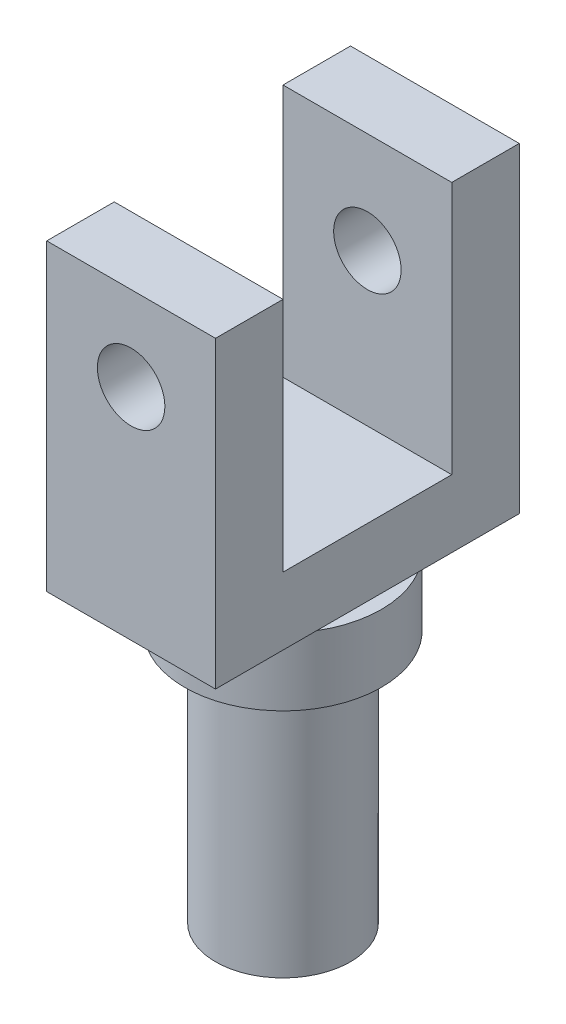
ISO-10303-21;
HEADER;
FILE_DESCRIPTION(('STEP AP214'),'2;1');
FILE_NAME('part.step','',(''),(''),'','','');
FILE_SCHEMA(('AUTOMOTIVE_DESIGN { 1 0 10303 214 1 1 1 1 }'));
ENDSEC;
DATA;
#1=APPLICATION_CONTEXT('core data for automotive mechanical design processes');
#2=APPLICATION_PROTOCOL_DEFINITION('international standard','automotive_design',2000,#1);
#3=PRODUCT_CONTEXT('',#1,'mechanical');
#4=PRODUCT('Part','Part','',(#3));
#5=PRODUCT_RELATED_PRODUCT_CATEGORY('part','',(#4));
#6=PRODUCT_DEFINITION_FORMATION('','',#4);
#7=PRODUCT_DEFINITION_CONTEXT('part definition',#1,'design');
#8=PRODUCT_DEFINITION('design','',#6,#7);
#9=PRODUCT_DEFINITION_SHAPE('','',#8);
#10=(LENGTH_UNIT() NAMED_UNIT(*) SI_UNIT(.MILLI.,.METRE.));
#11=(NAMED_UNIT(*) PLANE_ANGLE_UNIT() SI_UNIT($,.RADIAN.));
#12=(NAMED_UNIT(*) SI_UNIT($,.STERADIAN.) SOLID_ANGLE_UNIT());
#13=UNCERTAINTY_MEASURE_WITH_UNIT(LENGTH_MEASURE(1.E-05),#10,'distance_accuracy_value','');
#14=(GEOMETRIC_REPRESENTATION_CONTEXT(3) GLOBAL_UNCERTAINTY_ASSIGNED_CONTEXT((#13)) GLOBAL_UNIT_ASSIGNED_CONTEXT((#10,
#11,#12)) REPRESENTATION_CONTEXT('',''));
#15=CARTESIAN_POINT('',(0.,0.,0.));
#16=DIRECTION('',(0.,0.,1.));
#17=DIRECTION('',(1.,0.,0.));
#18=AXIS2_PLACEMENT_3D('',#15,#16,#17);
#19=CARTESIAN_POINT('',(0.,-44.9999999999986,0.));
#20=DIRECTION('',(0.,1.,0.));
#21=DIRECTION('',(0.,0.,1.));
#22=AXIS2_PLACEMENT_3D('',#19,#20,#21);
#23=PLANE('',#22);
#24=DIRECTION('',(0.,0.,1.));
#25=VECTOR('',#24,1.);
#26=CARTESIAN_POINT('',(-245.845240525773,-44.9999999999986,20.));
#27=LINE('',#26,#25);
#28=CARTESIAN_POINT('',(-245.845240525773,-44.9999999999986,-50.));
#29=VERTEX_POINT('',#28);
#30=CARTESIAN_POINT('',(-245.845240525773,-44.9999999999986,0.));
#31=VERTEX_POINT('',#30);
#32=EDGE_CURVE('E151',#29,#31,#27,.T.);
#33=ORIENTED_EDGE('',*,*,#32,.F.);
#34=DIRECTION('',(1.,0.,0.));
#35=VECTOR('',#34,1.);
#36=CARTESIAN_POINT('',(0.,-44.9999999999986,-50.));
#37=LINE('',#36,#35);
#38=CARTESIAN_POINT('',(-295.845240525773,-44.9999999999986,-50.));
#39=VERTEX_POINT('',#38);
#40=EDGE_CURVE('E133',#39,#29,#37,.T.);
#41=ORIENTED_EDGE('',*,*,#40,.F.);
#42=DIRECTION('',(0.,0.,-1.));
#43=VECTOR('',#42,1.);
#44=CARTESIAN_POINT('',(-295.845240525773,-44.9999999999986,20.));
#45=LINE('',#44,#43);
#46=CARTESIAN_POINT('',(-295.845240525773,-44.9999999999986,0.));
#47=VERTEX_POINT('',#46);
#48=EDGE_CURVE('E138',#47,#39,#45,.T.);
#49=ORIENTED_EDGE('',*,*,#48,.F.);
#50=DIRECTION('',(1.,0.,0.));
#51=VECTOR('',#50,1.);
#52=CARTESIAN_POINT('',(-295.845240525773,-44.9999999999986,0.));
#53=LINE('',#52,#51);
#54=EDGE_CURVE('E189',#47,#31,#53,.T.);
#55=ORIENTED_EDGE('',*,*,#54,.T.);
#56=EDGE_LOOP('',(#33,#41,#49,#55));
#57=FACE_BOUND('',#56,.T.);
#58=ADVANCED_FACE('F34',(#57),#23,.T.);
#59=CARTESIAN_POINT('',(0.,-64.9999999999986,0.));
#60=DIRECTION('',(0.,1.,0.));
#61=DIRECTION('',(0.,0.,1.));
#62=AXIS2_PLACEMENT_3D('',#59,#60,#61);
#63=PLANE('',#62);
#64=CARTESIAN_POINT('',(-270.845240525773,-64.9999999999986,-25.));
#65=DIRECTION('',(0.,-1.,0.));
#66=DIRECTION('',(0.,0.,-1.));
#67=AXIS2_PLACEMENT_3D('',#64,#65,#66);
#68=CIRCLE('',#67,29.1547594742265);
#69=CARTESIAN_POINT('',(-245.845240525773,-64.9999999999986,-10.));
#70=VERTEX_POINT('',#69);
#71=CARTESIAN_POINT('',(-295.845240525773,-64.9999999999986,-10.0000000000001));
#72=VERTEX_POINT('',#71);
#73=EDGE_CURVE('E11',#70,#72,#68,.T.);
#74=ORIENTED_EDGE('',*,*,#73,.F.);
#75=DIRECTION('',(0.,0.,1.));
#76=VECTOR('',#75,1.);
#77=CARTESIAN_POINT('',(-245.845240525773,-64.9999999999986,20.));
#78=LINE('',#77,#76);
#79=CARTESIAN_POINT('',(-245.845240525773,-64.9999999999986,20.));
#80=VERTEX_POINT('',#79);
#81=EDGE_CURVE('E159',#70,#80,#78,.T.);
#82=ORIENTED_EDGE('',*,*,#81,.T.);
#83=DIRECTION('',(-1.,0.,0.));
#84=VECTOR('',#83,1.);
#85=CARTESIAN_POINT('',(-245.845240525773,-64.9999999999986,20.));
#86=LINE('',#85,#84);
#87=CARTESIAN_POINT('',(-295.845240525773,-64.9999999999986,20.));
#88=VERTEX_POINT('',#87);
#89=EDGE_CURVE('E157',#80,#88,#86,.T.);
#90=ORIENTED_EDGE('',*,*,#89,.T.);
#91=DIRECTION('',(0.,0.,-1.));
#92=VECTOR('',#91,1.);
#93=CARTESIAN_POINT('',(-295.845240525773,-64.9999999999986,20.));
#94=LINE('',#93,#92);
#95=EDGE_CURVE('E163',#88,#72,#94,.T.);
#96=ORIENTED_EDGE('',*,*,#95,.T.);
#97=EDGE_LOOP('',(#74,#82,#90,#96));
#98=FACE_BOUND('',#97,.T.);
#99=ADVANCED_FACE('F216',(#98),#63,.F.);
#100=CARTESIAN_POINT('',(0.,0.,20.));
#101=DIRECTION('',(0.,0.,1.));
#102=DIRECTION('',(1.,0.,0.));
#103=AXIS2_PLACEMENT_3D('',#100,#101,#102);
#104=PLANE('',#103);
#105=DIRECTION('',(0.,-1.,0.));
#106=VECTOR('',#105,1.);
#107=CARTESIAN_POINT('',(-295.845240525773,25.0000000000014,20.));
#108=LINE('',#107,#106);
#109=CARTESIAN_POINT('',(-295.845240525773,25.0000000000014,20.));
#110=VERTEX_POINT('',#109);
#111=EDGE_CURVE('E180',#110,#88,#108,.T.);
#112=ORIENTED_EDGE('',*,*,#111,.T.);
#113=ORIENTED_EDGE('',*,*,#89,.F.);
#114=DIRECTION('',(0.,1.,0.));
#115=VECTOR('',#114,1.);
#116=CARTESIAN_POINT('',(-245.845240525773,25.0000000000014,20.));
#117=LINE('',#116,#115);
#118=CARTESIAN_POINT('',(-245.845240525773,25.0000000000014,20.));
#119=VERTEX_POINT('',#118);
#120=EDGE_CURVE('E182',#80,#119,#117,.T.);
#121=ORIENTED_EDGE('',*,*,#120,.T.);
#122=DIRECTION('',(-1.,0.,0.));
#123=VECTOR('',#122,1.);
#124=CARTESIAN_POINT('',(-295.845240525773,25.0000000000014,20.));
#125=LINE('',#124,#123);
#126=EDGE_CURVE('E185',#119,#110,#125,.T.);
#127=ORIENTED_EDGE('',*,*,#126,.T.);
#128=EDGE_LOOP('',(#112,#113,#121,#127));
#129=FACE_BOUND('',#128,.T.);
#130=CARTESIAN_POINT('',(-270.845240525773,1.3455678371813E-12,20.));
#131=DIRECTION('',(0.,0.,1.));
#132=DIRECTION('',(1.,0.,0.));
#133=AXIS2_PLACEMENT_3D('',#130,#131,#132);
#134=CIRCLE('',#133,9.99999999999992);
#135=CARTESIAN_POINT('',(-260.845240525774,1.3455678371813E-12,20.));
#136=VERTEX_POINT('',#135);
#137=EDGE_CURVE('E174',#136,#136,#134,.T.);
#138=ORIENTED_EDGE('',*,*,#137,.F.);
#139=EDGE_LOOP('',(#138));
#140=FACE_BOUND('',#139,.T.);
#141=ADVANCED_FACE('F220',(#129,#140),#104,.T.);
#142=CARTESIAN_POINT('',(0.,0.,0.));
#143=DIRECTION('',(0.,0.,1.));
#144=DIRECTION('',(1.,0.,0.));
#145=AXIS2_PLACEMENT_3D('',#142,#143,#144);
#146=PLANE('',#145);
#147=DIRECTION('',(0.,-1.,0.));
#148=VECTOR('',#147,1.);
#149=CARTESIAN_POINT('',(-295.845240525773,25.0000000000014,0.));
#150=LINE('',#149,#148);
#151=CARTESIAN_POINT('',(-295.845240525773,25.0000000000014,0.));
#152=VERTEX_POINT('',#151);
#153=EDGE_CURVE('E177',#152,#47,#150,.T.);
#154=ORIENTED_EDGE('',*,*,#153,.F.);
#155=DIRECTION('',(-1.,0.,0.));
#156=VECTOR('',#155,1.);
#157=CARTESIAN_POINT('',(-295.845240525773,25.0000000000014,0.));
#158=LINE('',#157,#156);
#159=CARTESIAN_POINT('',(-245.845240525773,25.0000000000014,0.));
#160=VERTEX_POINT('',#159);
#161=EDGE_CURVE('E183',#160,#152,#158,.T.);
#162=ORIENTED_EDGE('',*,*,#161,.F.);
#163=DIRECTION('',(0.,1.,0.));
#164=VECTOR('',#163,1.);
#165=CARTESIAN_POINT('',(-245.845240525773,25.0000000000014,0.));
#166=LINE('',#165,#164);
#167=EDGE_CURVE('E192',#31,#160,#166,.T.);
#168=ORIENTED_EDGE('',*,*,#167,.F.);
#169=ORIENTED_EDGE('',*,*,#54,.F.);
#170=EDGE_LOOP('',(#154,#162,#168,#169));
#171=FACE_BOUND('',#170,.T.);
#172=CARTESIAN_POINT('',(-270.845240525773,1.3455678371813E-12,0.));
#173=DIRECTION('',(0.,0.,1.));
#174=DIRECTION('',(1.,0.,0.));
#175=AXIS2_PLACEMENT_3D('',#172,#173,#174);
#176=CIRCLE('',#175,9.99999999999992);
#177=CARTESIAN_POINT('',(-260.845240525774,1.3455678371813E-12,0.));
#178=VERTEX_POINT('',#177);
#179=EDGE_CURVE('E173',#178,#178,#176,.T.);
#180=ORIENTED_EDGE('',*,*,#179,.T.);
#181=EDGE_LOOP('',(#180));
#182=FACE_BOUND('',#181,.T.);
#183=ADVANCED_FACE('F340',(#171,#182),#146,.F.);
#184=CARTESIAN_POINT('',(-295.845240525773,25.0000000000014,20.));
#185=DIRECTION('',(1.,0.,0.));
#186=DIRECTION('',(0.,0.,-1.));
#187=AXIS2_PLACEMENT_3D('',#184,#185,#186);
#188=PLANE('',#187);
#189=ORIENTED_EDGE('',*,*,#153,.T.);
#190=ORIENTED_EDGE('',*,*,#48,.T.);
#191=DIRECTION('',(0.,-1.,0.));
#192=VECTOR('',#191,1.);
#193=CARTESIAN_POINT('',(-295.845240525773,30.0000000000014,-50.));
#194=LINE('',#193,#192);
#195=CARTESIAN_POINT('',(-295.845240525773,30.0000000000014,-50.));
#196=VERTEX_POINT('',#195);
#197=EDGE_CURVE('E117',#196,#39,#194,.T.);
#198=ORIENTED_EDGE('',*,*,#197,.F.);
#199=DIRECTION('',(0.,0.,1.));
#200=VECTOR('',#199,1.);
#201=CARTESIAN_POINT('',(-295.845240525773,30.0000000000014,0.));
#202=LINE('',#201,#200);
#203=CARTESIAN_POINT('',(-295.845240525773,30.0000000000014,-70.));
#204=VERTEX_POINT('',#203);
#205=EDGE_CURVE('E125',#204,#196,#202,.T.);
#206=ORIENTED_EDGE('',*,*,#205,.F.);
#207=DIRECTION('',(0.,1.,0.));
#208=VECTOR('',#207,1.);
#209=CARTESIAN_POINT('',(-295.845240525773,-64.9999999999986,-70.));
#210=LINE('',#209,#208);
#211=CARTESIAN_POINT('',(-295.845240525773,-64.9999999999986,-70.));
#212=VERTEX_POINT('',#211);
#213=EDGE_CURVE('E171',#212,#204,#210,.T.);
#214=ORIENTED_EDGE('',*,*,#213,.F.);
#215=CARTESIAN_POINT('',(-295.845240525773,-64.9999999999986,-39.9999999999999));
#216=VERTEX_POINT('',#215);
#217=EDGE_CURVE('E162',#216,#212,#94,.T.);
#218=ORIENTED_EDGE('',*,*,#217,.F.);
#219=EDGE_CURVE('E58',#72,#216,#94,.T.);
#220=ORIENTED_EDGE('',*,*,#219,.F.);
#221=ORIENTED_EDGE('',*,*,#95,.F.);
#222=ORIENTED_EDGE('',*,*,#111,.F.);
#223=DIRECTION('',(0.,0.,-1.));
#224=VECTOR('',#223,1.);
#225=CARTESIAN_POINT('',(-295.845240525773,25.0000000000014,20.));
#226=LINE('',#225,#224);
#227=EDGE_CURVE('E187',#110,#152,#226,.T.);
#228=ORIENTED_EDGE('',*,*,#227,.T.);
#229=EDGE_LOOP('',(#189,#190,#198,#206,#214,#218,#220,#221,#222,#228));
#230=FACE_BOUND('',#229,.T.);
#231=ADVANCED_FACE('F36',(#230),#188,.F.);
#232=CARTESIAN_POINT('',(-245.845240525773,25.0000000000014,20.));
#233=DIRECTION('',(-1.,0.,0.));
#234=DIRECTION('',(0.,0.,1.));
#235=AXIS2_PLACEMENT_3D('',#232,#233,#234);
#236=PLANE('',#235);
#237=ORIENTED_EDGE('',*,*,#167,.T.);
#238=DIRECTION('',(0.,0.,-1.));
#239=VECTOR('',#238,1.);
#240=CARTESIAN_POINT('',(-245.845240525773,25.0000000000014,20.));
#241=LINE('',#240,#239);
#242=EDGE_CURVE('E196',#119,#160,#241,.T.);
#243=ORIENTED_EDGE('',*,*,#242,.F.);
#244=ORIENTED_EDGE('',*,*,#120,.F.);
#245=ORIENTED_EDGE('',*,*,#81,.F.);
#246=CARTESIAN_POINT('',(-245.845240525773,-64.9999999999986,-40.));
#247=VERTEX_POINT('',#246);
#248=EDGE_CURVE('E158',#247,#70,#78,.T.);
#249=ORIENTED_EDGE('',*,*,#248,.F.);
#250=CARTESIAN_POINT('',(-245.845240525773,-64.9999999999986,-70.));
#251=VERTEX_POINT('',#250);
#252=EDGE_CURVE('E155',#251,#247,#78,.T.);
#253=ORIENTED_EDGE('',*,*,#252,.F.);
#254=DIRECTION('',(0.,1.,0.));
#255=VECTOR('',#254,1.);
#256=CARTESIAN_POINT('',(-245.845240525773,-64.9999999999986,-70.));
#257=LINE('',#256,#255);
#258=CARTESIAN_POINT('',(-245.845240525773,30.0000000000014,-70.));
#259=VERTEX_POINT('',#258);
#260=EDGE_CURVE('E167',#251,#259,#257,.T.);
#261=ORIENTED_EDGE('',*,*,#260,.T.);
#262=DIRECTION('',(0.,0.,-1.));
#263=VECTOR('',#262,1.);
#264=CARTESIAN_POINT('',(-245.845240525773,30.0000000000014,0.));
#265=LINE('',#264,#263);
#266=CARTESIAN_POINT('',(-245.845240525773,30.0000000000014,-50.));
#267=VERTEX_POINT('',#266);
#268=EDGE_CURVE('E124',#267,#259,#265,.T.);
#269=ORIENTED_EDGE('',*,*,#268,.F.);
#270=DIRECTION('',(0.,-1.,0.));
#271=VECTOR('',#270,1.);
#272=CARTESIAN_POINT('',(-245.845240525773,30.0000000000014,-50.));
#273=LINE('',#272,#271);
#274=EDGE_CURVE('E120',#267,#29,#273,.T.);
#275=ORIENTED_EDGE('',*,*,#274,.T.);
#276=ORIENTED_EDGE('',*,*,#32,.T.);
#277=EDGE_LOOP('',(#237,#243,#244,#245,#249,#253,#261,#269,#275,#276));
#278=FACE_BOUND('',#277,.T.);
#279=ADVANCED_FACE('F218',(#278),#236,.F.);
#280=CARTESIAN_POINT('',(-295.845240525773,25.0000000000014,20.));
#281=DIRECTION('',(0.,-1.,0.));
#282=DIRECTION('',(0.,0.,-1.));
#283=AXIS2_PLACEMENT_3D('',#280,#281,#282);
#284=PLANE('',#283);
#285=ORIENTED_EDGE('',*,*,#161,.T.);
#286=ORIENTED_EDGE('',*,*,#227,.F.);
#287=ORIENTED_EDGE('',*,*,#126,.F.);
#288=ORIENTED_EDGE('',*,*,#242,.T.);
#289=EDGE_LOOP('',(#285,#286,#287,#288));
#290=FACE_BOUND('',#289,.T.);
#291=ADVANCED_FACE('F253',(#290),#284,.F.);
#292=CARTESIAN_POINT('',(-270.845240525773,1.3455678371813E-12,20.));
#293=DIRECTION('',(0.,0.,-1.));
#294=DIRECTION('',(-1.,0.,0.));
#295=AXIS2_PLACEMENT_3D('',#292,#293,#294);
#296=CYLINDRICAL_SURFACE('',#295,9.99999999999992);
#297=ORIENTED_EDGE('',*,*,#179,.F.);
#298=EDGE_LOOP('',(#297));
#299=FACE_BOUND('',#298,.T.);
#300=ORIENTED_EDGE('',*,*,#137,.T.);
#301=EDGE_LOOP('',(#300));
#302=FACE_BOUND('',#301,.T.);
#303=ADVANCED_FACE('F246',(#299,#302),#296,.F.);
#304=CARTESIAN_POINT('',(-245.845240525773,-64.9999999999986,-70.));
#305=DIRECTION('',(0.,0.,1.));
#306=DIRECTION('',(1.,0.,0.));
#307=AXIS2_PLACEMENT_3D('',#304,#305,#306);
#308=PLANE('',#307);
#309=CARTESIAN_POINT('',(-270.845240525773,1.3455678371813E-12,-70.));
#310=DIRECTION('',(0.,0.,-1.));
#311=DIRECTION('',(-1.,0.,0.));
#312=AXIS2_PLACEMENT_3D('',#309,#310,#311);
#313=CIRCLE('',#312,9.99999999999992);
#314=CARTESIAN_POINT('',(-280.845240525773,1.3455678371813E-12,-70.));
#315=VERTEX_POINT('',#314);
#316=EDGE_CURVE('E235',#315,#315,#313,.T.);
#317=ORIENTED_EDGE('',*,*,#316,.F.);
#318=EDGE_LOOP('',(#317));
#319=FACE_BOUND('',#318,.T.);
#320=ORIENTED_EDGE('',*,*,#213,.T.);
#321=DIRECTION('',(-1.,0.,0.));
#322=VECTOR('',#321,1.);
#323=CARTESIAN_POINT('',(0.,30.0000000000014,-70.));
#324=LINE('',#323,#322);
#325=EDGE_CURVE('E131',#259,#204,#324,.T.);
#326=ORIENTED_EDGE('',*,*,#325,.F.);
#327=ORIENTED_EDGE('',*,*,#260,.F.);
#328=DIRECTION('',(1.,0.,0.));
#329=VECTOR('',#328,1.);
#330=CARTESIAN_POINT('',(-245.845240525773,-64.9999999999986,-70.));
#331=LINE('',#330,#329);
#332=EDGE_CURVE('E165',#212,#251,#331,.T.);
#333=ORIENTED_EDGE('',*,*,#332,.F.);
#334=EDGE_LOOP('',(#320,#326,#327,#333));
#335=FACE_BOUND('',#334,.T.);
#336=ADVANCED_FACE('F231',(#319,#335),#308,.F.);
#337=EDGE_CURVE('E43',#216,#247,#68,.T.);
#338=ORIENTED_EDGE('',*,*,#337,.F.);
#339=ORIENTED_EDGE('',*,*,#217,.T.);
#340=ORIENTED_EDGE('',*,*,#332,.T.);
#341=ORIENTED_EDGE('',*,*,#252,.T.);
#342=EDGE_LOOP('',(#338,#339,#340,#341));
#343=FACE_BOUND('',#342,.T.);
#344=ADVANCED_FACE('F227',(#343),#63,.F.);
#345=CARTESIAN_POINT('',(-270.845240525773,-64.9999999999986,-25.));
#346=DIRECTION('',(0.,-1.,0.));
#347=DIRECTION('',(0.,0.,-1.));
#348=AXIS2_PLACEMENT_3D('',#345,#346,#347);
#349=PLANE('',#348);
#350=EDGE_CURVE('E152',#247,#70,#68,.T.);
#351=ORIENTED_EDGE('',*,*,#350,.F.);
#352=ORIENTED_EDGE('',*,*,#248,.T.);
#353=EDGE_LOOP('',(#351,#352));
#354=FACE_BOUND('',#353,.T.);
#355=ADVANCED_FACE('F209',(#354),#349,.F.);
#356=EDGE_CURVE('E45',#72,#216,#68,.T.);
#357=ORIENTED_EDGE('',*,*,#356,.F.);
#358=ORIENTED_EDGE('',*,*,#219,.T.);
#359=EDGE_LOOP('',(#357,#358));
#360=FACE_BOUND('',#359,.T.);
#361=ADVANCED_FACE('F226',(#360),#349,.F.);
#362=CARTESIAN_POINT('',(-270.845240525773,-84.9999999999986,-25.));
#363=DIRECTION('',(0.,1.,0.));
#364=DIRECTION('',(0.,0.,1.));
#365=AXIS2_PLACEMENT_3D('',#362,#363,#364);
#366=CYLINDRICAL_SURFACE('',#365,29.1547594742265);
#367=CARTESIAN_POINT('',(-270.845240525773,-84.9999999999986,-25.));
#368=DIRECTION('',(0.,-1.,0.));
#369=DIRECTION('',(0.,0.,-1.));
#370=AXIS2_PLACEMENT_3D('',#367,#368,#369);
#371=CIRCLE('',#370,29.1547594742265);
#372=CARTESIAN_POINT('',(-270.845240525773,-84.9999999999986,-54.1547594742265));
#373=VERTEX_POINT('',#372);
#374=EDGE_CURVE('E149',#373,#373,#371,.T.);
#375=ORIENTED_EDGE('',*,*,#374,.F.);
#376=EDGE_LOOP('',(#375));
#377=FACE_BOUND('',#376,.T.);
#378=ORIENTED_EDGE('',*,*,#350,.T.);
#379=ORIENTED_EDGE('',*,*,#73,.T.);
#380=ORIENTED_EDGE('',*,*,#356,.T.);
#381=ORIENTED_EDGE('',*,*,#337,.T.);
#382=EDGE_LOOP('',(#378,#379,#380,#381));
#383=FACE_BOUND('',#382,.T.);
#384=ADVANCED_FACE('F205',(#377,#383),#366,.T.);
#385=CARTESIAN_POINT('',(-270.845240525773,-84.9999999999986,-25.));
#386=DIRECTION('',(0.,-1.,0.));
#387=DIRECTION('',(0.,0.,-1.));
#388=AXIS2_PLACEMENT_3D('',#385,#386,#387);
#389=PLANE('',#388);
#390=CARTESIAN_POINT('',(-270.845240525773,-84.9999999999986,-25.));
#391=DIRECTION('',(0.,-1.,0.));
#392=DIRECTION('',(0.,0.,-1.));
#393=AXIS2_PLACEMENT_3D('',#390,#391,#392);
#394=CIRCLE('',#393,20.);
#395=CARTESIAN_POINT('',(-270.845240525773,-84.9999999999986,-45.));
#396=VERTEX_POINT('',#395);
#397=EDGE_CURVE('E139',#396,#396,#394,.T.);
#398=ORIENTED_EDGE('',*,*,#397,.F.);
#399=EDGE_LOOP('',(#398));
#400=FACE_BOUND('',#399,.T.);
#401=ORIENTED_EDGE('',*,*,#374,.T.);
#402=EDGE_LOOP('',(#401));
#403=FACE_BOUND('',#402,.T.);
#404=ADVANCED_FACE('F266',(#400,#403),#389,.T.);
#405=CARTESIAN_POINT('',(-270.845240525773,-159.999999999999,-25.));
#406=DIRECTION('',(0.,1.,0.));
#407=DIRECTION('',(0.,0.,1.));
#408=AXIS2_PLACEMENT_3D('',#405,#406,#407);
#409=CYLINDRICAL_SURFACE('',#408,20.);
#410=CARTESIAN_POINT('',(-270.845240525773,-159.999999999999,-25.));
#411=DIRECTION('',(0.,-1.,0.));
#412=DIRECTION('',(0.,0.,-1.));
#413=AXIS2_PLACEMENT_3D('',#410,#411,#412);
#414=CIRCLE('',#413,20.);
#415=CARTESIAN_POINT('',(-270.845240525773,-159.999999999999,-45.));
#416=VERTEX_POINT('',#415);
#417=EDGE_CURVE('E142',#416,#416,#414,.T.);
#418=ORIENTED_EDGE('',*,*,#417,.F.);
#419=EDGE_LOOP('',(#418));
#420=FACE_BOUND('',#419,.T.);
#421=ORIENTED_EDGE('',*,*,#397,.T.);
#422=EDGE_LOOP('',(#421));
#423=FACE_BOUND('',#422,.T.);
#424=ADVANCED_FACE('F272',(#420,#423),#409,.T.);
#425=CARTESIAN_POINT('',(-270.845240525773,-159.999999999999,-25.));
#426=DIRECTION('',(0.,-1.,0.));
#427=DIRECTION('',(0.,0.,-1.));
#428=AXIS2_PLACEMENT_3D('',#425,#426,#427);
#429=PLANE('',#428);
#430=ORIENTED_EDGE('',*,*,#417,.T.);
#431=EDGE_LOOP('',(#430));
#432=FACE_BOUND('',#431,.T.);
#433=ADVANCED_FACE('F276',(#432),#429,.T.);
#434=CARTESIAN_POINT('',(0.,30.0000000000014,-50.));
#435=DIRECTION('',(0.,0.,-1.));
#436=DIRECTION('',(-1.,0.,0.));
#437=AXIS2_PLACEMENT_3D('',#434,#435,#436);
#438=PLANE('',#437);
#439=CARTESIAN_POINT('',(-270.845240525773,1.3455678371813E-12,-50.));
#440=DIRECTION('',(0.,0.,-1.));
#441=DIRECTION('',(-1.,0.,0.));
#442=AXIS2_PLACEMENT_3D('',#439,#440,#441);
#443=CIRCLE('',#442,9.99999999999992);
#444=CARTESIAN_POINT('',(-280.845240525773,1.3455678371813E-12,-50.));
#445=VERTEX_POINT('',#444);
#446=EDGE_CURVE('E38',#445,#445,#443,.T.);
#447=ORIENTED_EDGE('',*,*,#446,.T.);
#448=EDGE_LOOP('',(#447));
#449=FACE_BOUND('',#448,.T.);
#450=ORIENTED_EDGE('',*,*,#40,.T.);
#451=ORIENTED_EDGE('',*,*,#274,.F.);
#452=DIRECTION('',(1.,0.,0.));
#453=VECTOR('',#452,1.);
#454=CARTESIAN_POINT('',(0.,30.0000000000014,-50.));
#455=LINE('',#454,#453);
#456=EDGE_CURVE('E113',#196,#267,#455,.T.);
#457=ORIENTED_EDGE('',*,*,#456,.F.);
#458=ORIENTED_EDGE('',*,*,#197,.T.);
#459=EDGE_LOOP('',(#450,#451,#457,#458));
#460=FACE_BOUND('',#459,.T.);
#461=ADVANCED_FACE('F115',(#449,#460),#438,.F.);
#462=CARTESIAN_POINT('',(0.,30.0000000000014,0.));
#463=DIRECTION('',(0.,1.,0.));
#464=DIRECTION('',(0.,0.,1.));
#465=AXIS2_PLACEMENT_3D('',#462,#463,#464);
#466=PLANE('',#465);
#467=ORIENTED_EDGE('',*,*,#205,.T.);
#468=ORIENTED_EDGE('',*,*,#456,.T.);
#469=ORIENTED_EDGE('',*,*,#268,.T.);
#470=ORIENTED_EDGE('',*,*,#325,.T.);
#471=EDGE_LOOP('',(#467,#468,#469,#470));
#472=FACE_BOUND('',#471,.T.);
#473=ADVANCED_FACE('F129',(#472),#466,.T.);
#474=CARTESIAN_POINT('',(-270.845240525773,1.3455678371813E-12,5.));
#475=DIRECTION('',(0.,0.,-1.));
#476=DIRECTION('',(-1.,0.,0.));
#477=AXIS2_PLACEMENT_3D('',#474,#475,#476);
#478=CYLINDRICAL_SURFACE('',#477,9.99999999999992);
#479=ORIENTED_EDGE('',*,*,#316,.T.);
#480=EDGE_LOOP('',(#479));
#481=FACE_BOUND('',#480,.T.);
#482=ORIENTED_EDGE('',*,*,#446,.F.);
#483=EDGE_LOOP('',(#482));
#484=FACE_BOUND('',#483,.T.);
#485=ADVANCED_FACE('F242',(#481,#484),#478,.F.);
#486=CLOSED_SHELL('',(#58,#99,#141,#183,#231,#279,#291,#303,#336,#344,#355,#361,#384,#404,#424,
#433,#461,#473,#485));
#487=MANIFOLD_SOLID_BREP('B2',#486);
#488=ADVANCED_BREP_SHAPE_REPRESENTATION('',(#18,#487),#14);
#489=SHAPE_DEFINITION_REPRESENTATION(#9,#488);
ENDSEC;
END-ISO-10303-21;
